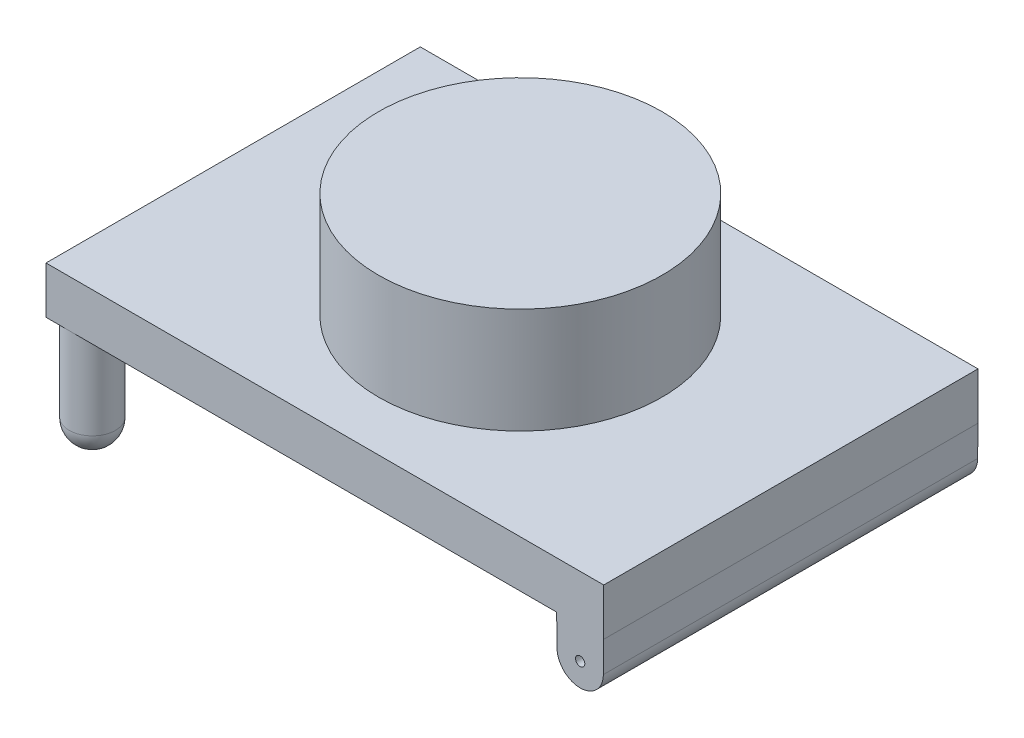
ISO-10303-21;
HEADER;
FILE_DESCRIPTION(('STEP AP214'),'2;1');
FILE_NAME('part.step','',(''),(''),'','','');
FILE_SCHEMA(('AUTOMOTIVE_DESIGN { 1 0 10303 214 1 1 1 1 }'));
ENDSEC;
DATA;
#1=APPLICATION_CONTEXT('core data for automotive mechanical design processes');
#2=APPLICATION_PROTOCOL_DEFINITION('international standard','automotive_design',2000,#1);
#3=PRODUCT_CONTEXT('',#1,'mechanical');
#4=PRODUCT('Part','Part','',(#3));
#5=PRODUCT_RELATED_PRODUCT_CATEGORY('part','',(#4));
#6=PRODUCT_DEFINITION_FORMATION('','',#4);
#7=PRODUCT_DEFINITION_CONTEXT('part definition',#1,'design');
#8=PRODUCT_DEFINITION('design','',#6,#7);
#9=PRODUCT_DEFINITION_SHAPE('','',#8);
#10=(LENGTH_UNIT() NAMED_UNIT(*) SI_UNIT(.MILLI.,.METRE.));
#11=(NAMED_UNIT(*) PLANE_ANGLE_UNIT() SI_UNIT($,.RADIAN.));
#12=(NAMED_UNIT(*) SI_UNIT($,.STERADIAN.) SOLID_ANGLE_UNIT());
#13=UNCERTAINTY_MEASURE_WITH_UNIT(LENGTH_MEASURE(1.E-05),#10,'distance_accuracy_value','');
#14=(GEOMETRIC_REPRESENTATION_CONTEXT(3) GLOBAL_UNCERTAINTY_ASSIGNED_CONTEXT((#13)) GLOBAL_UNIT_ASSIGNED_CONTEXT((#10,
#11,#12)) REPRESENTATION_CONTEXT('',''));
#15=CARTESIAN_POINT('',(0.,0.,0.));
#16=DIRECTION('',(0.,0.,1.));
#17=DIRECTION('',(1.,0.,0.));
#18=AXIS2_PLACEMENT_3D('',#15,#16,#17);
#19=CARTESIAN_POINT('',(0.,34.6,-101.));
#20=DIRECTION('',(0.,-1.,0.));
#21=DIRECTION('',(0.,0.,-1.));
#22=AXIS2_PLACEMENT_3D('',#19,#20,#21);
#23=PLANE('',#22);
#24=DIRECTION('',(1.,0.,0.));
#25=VECTOR('',#24,1.);
#26=CARTESIAN_POINT('',(0.,34.6,-101.));
#27=LINE('',#26,#25);
#28=CARTESIAN_POINT('',(-150.5,34.6,-101.));
#29=VERTEX_POINT('',#28);
#30=CARTESIAN_POINT('',(-138.,34.6,-101.));
#31=VERTEX_POINT('',#30);
#32=EDGE_CURVE('E119',#29,#31,#27,.T.);
#33=ORIENTED_EDGE('',*,*,#32,.T.);
#34=CARTESIAN_POINT('',(-138.,34.6,-88.5000000000004));
#35=DIRECTION('',(0.,-1.,0.));
#36=DIRECTION('',(0.,0.,-1.));
#37=AXIS2_PLACEMENT_3D('',#34,#35,#36);
#38=CIRCLE('',#37,12.5);
#39=CARTESIAN_POINT('',(-150.5,34.6,-88.5000000000004));
#40=VERTEX_POINT('',#39);
#41=EDGE_CURVE('E53',#31,#40,#38,.F.);
#42=ORIENTED_EDGE('',*,*,#41,.T.);
#43=DIRECTION('',(0.,0.,1.));
#44=VECTOR('',#43,1.);
#45=CARTESIAN_POINT('',(-150.5,34.6,-101.));
#46=LINE('',#45,#44);
#47=EDGE_CURVE('E117',#29,#40,#46,.T.);
#48=ORIENTED_EDGE('',*,*,#47,.F.);
#49=EDGE_LOOP('',(#33,#42,#48));
#50=FACE_BOUND('',#49,.T.);
#51=ADVANCED_FACE('F38',(#50),#23,.T.);
#52=CARTESIAN_POINT('',(-150.5,34.6,88.5));
#53=VERTEX_POINT('',#52);
#54=CARTESIAN_POINT('',(-150.5,34.6,101.));
#55=VERTEX_POINT('',#54);
#56=EDGE_CURVE('E127',#53,#55,#46,.T.);
#57=ORIENTED_EDGE('',*,*,#56,.F.);
#58=CARTESIAN_POINT('',(-138.,34.6,88.5));
#59=DIRECTION('',(0.,-1.,0.));
#60=DIRECTION('',(0.,0.,-1.));
#61=AXIS2_PLACEMENT_3D('',#58,#59,#60);
#62=CIRCLE('',#61,12.5);
#63=CARTESIAN_POINT('',(-138.,34.6,101.));
#64=VERTEX_POINT('',#63);
#65=EDGE_CURVE('E112',#64,#53,#62,.T.);
#66=ORIENTED_EDGE('',*,*,#65,.F.);
#67=DIRECTION('',(1.,0.,0.));
#68=VECTOR('',#67,1.);
#69=CARTESIAN_POINT('',(0.,34.6,101.));
#70=LINE('',#69,#68);
#71=EDGE_CURVE('E252',#55,#64,#70,.T.);
#72=ORIENTED_EDGE('',*,*,#71,.F.);
#73=EDGE_LOOP('',(#57,#66,#72));
#74=FACE_BOUND('',#73,.T.);
#75=ADVANCED_FACE('F188',(#74),#23,.T.);
#76=CARTESIAN_POINT('',(-150.5,60.,101.));
#77=DIRECTION('',(1.,0.,0.));
#78=DIRECTION('',(0.,0.,-1.));
#79=AXIS2_PLACEMENT_3D('',#76,#77,#78);
#80=PLANE('',#79);
#81=ORIENTED_EDGE('',*,*,#47,.T.);
#82=EDGE_CURVE('E61',#40,#53,#46,.T.);
#83=ORIENTED_EDGE('',*,*,#82,.T.);
#84=ORIENTED_EDGE('',*,*,#56,.T.);
#85=DIRECTION('',(0.,-1.,0.));
#86=VECTOR('',#85,1.);
#87=CARTESIAN_POINT('',(-150.5,60.,101.));
#88=LINE('',#87,#86);
#89=CARTESIAN_POINT('',(-150.5,60.,101.));
#90=VERTEX_POINT('',#89);
#91=EDGE_CURVE('E164',#90,#55,#88,.T.);
#92=ORIENTED_EDGE('',*,*,#91,.F.);
#93=DIRECTION('',(0.,0.,1.));
#94=VECTOR('',#93,1.);
#95=CARTESIAN_POINT('',(-150.5,60.,101.));
#96=LINE('',#95,#94);
#97=CARTESIAN_POINT('',(-150.5,60.,-101.));
#98=VERTEX_POINT('',#97);
#99=EDGE_CURVE('E148',#98,#90,#96,.T.);
#100=ORIENTED_EDGE('',*,*,#99,.F.);
#101=DIRECTION('',(0.,-1.,0.));
#102=VECTOR('',#101,1.);
#103=CARTESIAN_POINT('',(-150.5,60.,-101.));
#104=LINE('',#103,#102);
#105=EDGE_CURVE('E133',#98,#29,#104,.T.);
#106=ORIENTED_EDGE('',*,*,#105,.T.);
#107=EDGE_LOOP('',(#81,#83,#84,#92,#100,#106));
#108=FACE_BOUND('',#107,.T.);
#109=ADVANCED_FACE('F130',(#108),#80,.F.);
#110=CARTESIAN_POINT('',(150.5,60.,101.));
#111=DIRECTION('',(0.,0.,-1.));
#112=DIRECTION('',(-1.,0.,0.));
#113=AXIS2_PLACEMENT_3D('',#110,#111,#112);
#114=PLANE('',#113);
#115=CARTESIAN_POINT('',(137.8,18.,101.));
#116=DIRECTION('',(0.,0.,1.));
#117=DIRECTION('',(1.,0.,0.));
#118=AXIS2_PLACEMENT_3D('',#115,#116,#117);
#119=CIRCLE('',#118,2.5);
#120=CARTESIAN_POINT('',(140.3,18.,101.));
#121=VERTEX_POINT('',#120);
#122=EDGE_CURVE('E229',#121,#121,#119,.T.);
#123=ORIENTED_EDGE('',*,*,#122,.F.);
#124=EDGE_LOOP('',(#123));
#125=FACE_BOUND('',#124,.T.);
#126=DIRECTION('',(0.012047318414772,0.99992742842619,0.));
#127=VECTOR('',#126,1.);
#128=CARTESIAN_POINT('',(150.061349782293,-1.80796806966598,101.));
#129=LINE('',#128,#127);
#130=CARTESIAN_POINT('',(150.3,18.,101.));
#131=VERTEX_POINT('',#130);
#132=CARTESIAN_POINT('',(150.5,34.6,101.));
#133=VERTEX_POINT('',#132);
#134=EDGE_CURVE('E241',#131,#133,#129,.T.);
#135=ORIENTED_EDGE('',*,*,#134,.T.);
#136=DIRECTION('',(0.,-1.,0.));
#137=VECTOR('',#136,1.);
#138=CARTESIAN_POINT('',(150.5,60.,101.));
#139=LINE('',#138,#137);
#140=CARTESIAN_POINT('',(150.5,60.,101.));
#141=VERTEX_POINT('',#140);
#142=EDGE_CURVE('E161',#141,#133,#139,.T.);
#143=ORIENTED_EDGE('',*,*,#142,.F.);
#144=DIRECTION('',(1.,0.,0.));
#145=VECTOR('',#144,1.);
#146=CARTESIAN_POINT('',(150.5,60.,101.));
#147=LINE('',#146,#145);
#148=EDGE_CURVE('E151',#90,#141,#147,.T.);
#149=ORIENTED_EDGE('',*,*,#148,.F.);
#150=ORIENTED_EDGE('',*,*,#91,.T.);
#151=ORIENTED_EDGE('',*,*,#71,.T.);
#152=CARTESIAN_POINT('',(125.1,34.6,101.));
#153=VERTEX_POINT('',#152);
#154=EDGE_CURVE('E251',#64,#153,#70,.T.);
#155=ORIENTED_EDGE('',*,*,#154,.T.);
#156=DIRECTION('',(-0.012047318414772,0.99992742842619,0.));
#157=VECTOR('',#156,1.);
#158=CARTESIAN_POINT('',(125.498650217706,1.51203193033365,101.));
#159=LINE('',#158,#157);
#160=CARTESIAN_POINT('',(125.3,18.,101.));
#161=VERTEX_POINT('',#160);
#162=EDGE_CURVE('E249',#161,#153,#159,.T.);
#163=ORIENTED_EDGE('',*,*,#162,.F.);
#164=CARTESIAN_POINT('',(137.8,18.,101.));
#165=DIRECTION('',(0.,0.,1.));
#166=DIRECTION('',(1.,0.,0.));
#167=AXIS2_PLACEMENT_3D('',#164,#165,#166);
#168=CIRCLE('',#167,12.5);
#169=EDGE_CURVE('E237',#161,#131,#168,.T.);
#170=ORIENTED_EDGE('',*,*,#169,.T.);
#171=EDGE_LOOP('',(#135,#143,#149,#150,#151,#155,#163,#170));
#172=FACE_BOUND('',#171,.T.);
#173=ADVANCED_FACE('F264',(#125,#172),#114,.F.);
#174=CARTESIAN_POINT('',(150.5,60.,101.));
#175=DIRECTION('',(-1.,0.,0.));
#176=DIRECTION('',(0.,0.,1.));
#177=AXIS2_PLACEMENT_3D('',#174,#175,#176);
#178=PLANE('',#177);
#179=DIRECTION('',(0.,0.,1.));
#180=VECTOR('',#179,1.);
#181=CARTESIAN_POINT('',(150.5,34.6,-101.));
#182=LINE('',#181,#180);
#183=CARTESIAN_POINT('',(150.5,34.6,-101.));
#184=VERTEX_POINT('',#183);
#185=EDGE_CURVE('E134',#184,#133,#182,.T.);
#186=ORIENTED_EDGE('',*,*,#185,.F.);
#187=DIRECTION('',(0.,-1.,0.));
#188=VECTOR('',#187,1.);
#189=CARTESIAN_POINT('',(150.5,60.,-101.));
#190=LINE('',#189,#188);
#191=CARTESIAN_POINT('',(150.5,60.,-101.));
#192=VERTEX_POINT('',#191);
#193=EDGE_CURVE('E158',#192,#184,#190,.T.);
#194=ORIENTED_EDGE('',*,*,#193,.F.);
#195=DIRECTION('',(0.,0.,-1.));
#196=VECTOR('',#195,1.);
#197=CARTESIAN_POINT('',(150.5,60.,101.));
#198=LINE('',#197,#196);
#199=EDGE_CURVE('E153',#141,#192,#198,.T.);
#200=ORIENTED_EDGE('',*,*,#199,.F.);
#201=ORIENTED_EDGE('',*,*,#142,.T.);
#202=EDGE_LOOP('',(#186,#194,#200,#201));
#203=FACE_BOUND('',#202,.T.);
#204=ADVANCED_FACE('F273',(#203),#178,.F.);
#205=CARTESIAN_POINT('',(150.5,60.,-101.));
#206=DIRECTION('',(0.,0.,1.));
#207=DIRECTION('',(1.,0.,0.));
#208=AXIS2_PLACEMENT_3D('',#205,#206,#207);
#209=PLANE('',#208);
#210=CARTESIAN_POINT('',(137.8,18.,-101.));
#211=DIRECTION('',(0.,0.,1.));
#212=DIRECTION('',(1.,0.,0.));
#213=AXIS2_PLACEMENT_3D('',#210,#211,#212);
#214=CIRCLE('',#213,2.5);
#215=CARTESIAN_POINT('',(140.3,18.,-101.));
#216=VERTEX_POINT('',#215);
#217=EDGE_CURVE('E113',#216,#216,#214,.T.);
#218=ORIENTED_EDGE('',*,*,#217,.T.);
#219=EDGE_LOOP('',(#218));
#220=FACE_BOUND('',#219,.T.);
#221=DIRECTION('',(0.012047318414772,0.99992742842619,0.));
#222=VECTOR('',#221,1.);
#223=CARTESIAN_POINT('',(150.061349782293,-1.80796806966598,-101.));
#224=LINE('',#223,#222);
#225=CARTESIAN_POINT('',(150.3,18.,-101.));
#226=VERTEX_POINT('',#225);
#227=EDGE_CURVE('E145',#226,#184,#224,.T.);
#228=ORIENTED_EDGE('',*,*,#227,.F.);
#229=CARTESIAN_POINT('',(137.8,18.,-101.));
#230=DIRECTION('',(0.,0.,1.));
#231=DIRECTION('',(1.,0.,0.));
#232=AXIS2_PLACEMENT_3D('',#229,#230,#231);
#233=CIRCLE('',#232,12.5);
#234=CARTESIAN_POINT('',(125.3,18.,-101.));
#235=VERTEX_POINT('',#234);
#236=EDGE_CURVE('E238',#235,#226,#233,.T.);
#237=ORIENTED_EDGE('',*,*,#236,.F.);
#238=DIRECTION('',(-0.012047318414772,0.99992742842619,0.));
#239=VECTOR('',#238,1.);
#240=CARTESIAN_POINT('',(125.498650217706,1.51203193033365,-101.));
#241=LINE('',#240,#239);
#242=CARTESIAN_POINT('',(125.1,34.6,-101.));
#243=VERTEX_POINT('',#242);
#244=EDGE_CURVE('E240',#235,#243,#241,.T.);
#245=ORIENTED_EDGE('',*,*,#244,.T.);
#246=EDGE_CURVE('E244',#31,#243,#27,.T.);
#247=ORIENTED_EDGE('',*,*,#246,.F.);
#248=ORIENTED_EDGE('',*,*,#32,.F.);
#249=ORIENTED_EDGE('',*,*,#105,.F.);
#250=DIRECTION('',(-1.,0.,0.));
#251=VECTOR('',#250,1.);
#252=CARTESIAN_POINT('',(150.5,60.,-101.));
#253=LINE('',#252,#251);
#254=EDGE_CURVE('E155',#192,#98,#253,.T.);
#255=ORIENTED_EDGE('',*,*,#254,.F.);
#256=ORIENTED_EDGE('',*,*,#193,.T.);
#257=EDGE_LOOP('',(#228,#237,#245,#247,#248,#249,#255,#256));
#258=FACE_BOUND('',#257,.T.);
#259=ADVANCED_FACE('F268',(#220,#258),#209,.F.);
#260=CARTESIAN_POINT('',(0.,60.,0.));
#261=DIRECTION('',(0.,1.,0.));
#262=DIRECTION('',(0.,0.,1.));
#263=AXIS2_PLACEMENT_3D('',#260,#261,#262);
#264=PLANE('',#263);
#265=CARTESIAN_POINT('',(1.99999999999988,60.,-2.50000000000022));
#266=DIRECTION('',(0.,1.,0.));
#267=DIRECTION('',(0.,0.,1.));
#268=AXIS2_PLACEMENT_3D('',#265,#266,#267);
#269=CIRCLE('',#268,76.5000000000002);
#270=CARTESIAN_POINT('',(1.99999999999988,60.,-79.0000000000004));
#271=VERTEX_POINT('',#270);
#272=EDGE_CURVE('E11',#271,#271,#269,.T.);
#273=ORIENTED_EDGE('',*,*,#272,.F.);
#274=EDGE_LOOP('',(#273));
#275=FACE_BOUND('',#274,.T.);
#276=ORIENTED_EDGE('',*,*,#99,.T.);
#277=ORIENTED_EDGE('',*,*,#148,.T.);
#278=ORIENTED_EDGE('',*,*,#199,.T.);
#279=ORIENTED_EDGE('',*,*,#254,.T.);
#280=EDGE_LOOP('',(#276,#277,#278,#279));
#281=FACE_BOUND('',#280,.T.);
#282=ADVANCED_FACE('F210',(#275,#281),#264,.T.);
#283=CARTESIAN_POINT('',(137.8,18.,-101.));
#284=DIRECTION('',(0.,0.,1.));
#285=DIRECTION('',(1.,0.,0.));
#286=AXIS2_PLACEMENT_3D('',#283,#284,#285);
#287=CYLINDRICAL_SURFACE('',#286,12.5);
#288=ORIENTED_EDGE('',*,*,#169,.F.);
#289=DIRECTION('',(0.,0.,1.));
#290=VECTOR('',#289,1.);
#291=CARTESIAN_POINT('',(125.3,18.,-101.));
#292=LINE('',#291,#290);
#293=EDGE_CURVE('E142',#235,#161,#292,.T.);
#294=ORIENTED_EDGE('',*,*,#293,.F.);
#295=ORIENTED_EDGE('',*,*,#236,.T.);
#296=DIRECTION('',(0.,0.,1.));
#297=VECTOR('',#296,1.);
#298=CARTESIAN_POINT('',(150.3,18.,-101.));
#299=LINE('',#298,#297);
#300=EDGE_CURVE('E135',#226,#131,#299,.T.);
#301=ORIENTED_EDGE('',*,*,#300,.T.);
#302=EDGE_LOOP('',(#288,#294,#295,#301));
#303=FACE_BOUND('',#302,.T.);
#304=ADVANCED_FACE('F205',(#303),#287,.T.);
#305=CARTESIAN_POINT('',(150.061349782293,-1.80796806966598,-101.));
#306=DIRECTION('',(0.99992742842619,-0.012047318414772,0.));
#307=DIRECTION('',(0.012047318414772,0.99992742842619,0.));
#308=AXIS2_PLACEMENT_3D('',#305,#306,#307);
#309=PLANE('',#308);
#310=ORIENTED_EDGE('',*,*,#134,.F.);
#311=ORIENTED_EDGE('',*,*,#300,.F.);
#312=ORIENTED_EDGE('',*,*,#227,.T.);
#313=ORIENTED_EDGE('',*,*,#185,.T.);
#314=EDGE_LOOP('',(#310,#311,#312,#313));
#315=FACE_BOUND('',#314,.T.);
#316=ADVANCED_FACE('F199',(#315),#309,.T.);
#317=ORIENTED_EDGE('',*,*,#82,.F.);
#318=CARTESIAN_POINT('',(-138.,34.6,-88.5000000000004));
#319=DIRECTION('',(0.,-1.,0.));
#320=DIRECTION('',(0.,0.,-1.));
#321=AXIS2_PLACEMENT_3D('',#318,#319,#320);
#322=CIRCLE('',#321,12.5);
#323=EDGE_CURVE('E108',#31,#40,#322,.T.);
#324=ORIENTED_EDGE('',*,*,#323,.F.);
#325=ORIENTED_EDGE('',*,*,#246,.T.);
#326=DIRECTION('',(0.,0.,1.));
#327=VECTOR('',#326,1.);
#328=CARTESIAN_POINT('',(125.1,34.6,-101.));
#329=LINE('',#328,#327);
#330=EDGE_CURVE('E138',#243,#153,#329,.T.);
#331=ORIENTED_EDGE('',*,*,#330,.T.);
#332=ORIENTED_EDGE('',*,*,#154,.F.);
#333=CARTESIAN_POINT('',(-138.,34.6,88.5));
#334=DIRECTION('',(0.,-1.,0.));
#335=DIRECTION('',(0.,0.,-1.));
#336=AXIS2_PLACEMENT_3D('',#333,#334,#335);
#337=CIRCLE('',#336,12.5);
#338=EDGE_CURVE('E121',#64,#53,#337,.F.);
#339=ORIENTED_EDGE('',*,*,#338,.T.);
#340=EDGE_LOOP('',(#317,#324,#325,#331,#332,#339));
#341=FACE_BOUND('',#340,.T.);
#342=ADVANCED_FACE('F124',(#341),#23,.T.);
#343=CARTESIAN_POINT('',(125.498650217706,1.51203193033365,-101.));
#344=DIRECTION('',(0.99992742842619,0.012047318414772,0.));
#345=DIRECTION('',(-0.012047318414772,0.99992742842619,0.));
#346=AXIS2_PLACEMENT_3D('',#343,#344,#345);
#347=PLANE('',#346);
#348=ORIENTED_EDGE('',*,*,#162,.T.);
#349=ORIENTED_EDGE('',*,*,#330,.F.);
#350=ORIENTED_EDGE('',*,*,#244,.F.);
#351=ORIENTED_EDGE('',*,*,#293,.T.);
#352=EDGE_LOOP('',(#348,#349,#350,#351));
#353=FACE_BOUND('',#352,.T.);
#354=ADVANCED_FACE('F198',(#353),#347,.F.);
#355=CARTESIAN_POINT('',(-138.,-24.5,88.5));
#356=DIRECTION('',(0.,1.,0.));
#357=DIRECTION('',(0.,0.,1.));
#358=AXIS2_PLACEMENT_3D('',#355,#356,#357);
#359=CYLINDRICAL_SURFACE('',#358,12.5);
#360=CARTESIAN_POINT('',(-138.,-12.,88.5));
#361=DIRECTION('',(0.,1.,0.));
#362=DIRECTION('',(0.,0.,1.));
#363=AXIS2_PLACEMENT_3D('',#360,#361,#362);
#364=CIRCLE('',#363,12.5);
#365=CARTESIAN_POINT('',(-138.,-12.,101.));
#366=VERTEX_POINT('',#365);
#367=EDGE_CURVE('E42',#366,#366,#364,.T.);
#368=ORIENTED_EDGE('',*,*,#367,.T.);
#369=EDGE_LOOP('',(#368));
#370=FACE_BOUND('',#369,.T.);
#371=ORIENTED_EDGE('',*,*,#65,.T.);
#372=ORIENTED_EDGE('',*,*,#338,.F.);
#373=EDGE_LOOP('',(#371,#372));
#374=FACE_BOUND('',#373,.T.);
#375=ADVANCED_FACE('F173',(#370,#374),#359,.T.);
#376=CARTESIAN_POINT('',(-138.,-24.5,-88.5000000000004));
#377=DIRECTION('',(0.,1.,0.));
#378=DIRECTION('',(0.,0.,1.));
#379=AXIS2_PLACEMENT_3D('',#376,#377,#378);
#380=CYLINDRICAL_SURFACE('',#379,12.5);
#381=CARTESIAN_POINT('',(-138.,-12.,-88.5000000000004));
#382=DIRECTION('',(0.,1.,0.));
#383=DIRECTION('',(0.,0.,1.));
#384=AXIS2_PLACEMENT_3D('',#381,#382,#383);
#385=CIRCLE('',#384,12.5);
#386=CARTESIAN_POINT('',(-138.,-12.,-76.0000000000004));
#387=VERTEX_POINT('',#386);
#388=EDGE_CURVE('E120',#387,#387,#385,.T.);
#389=ORIENTED_EDGE('',*,*,#388,.T.);
#390=EDGE_LOOP('',(#389));
#391=FACE_BOUND('',#390,.T.);
#392=ORIENTED_EDGE('',*,*,#323,.T.);
#393=ORIENTED_EDGE('',*,*,#41,.F.);
#394=EDGE_LOOP('',(#392,#393));
#395=FACE_BOUND('',#394,.T.);
#396=ADVANCED_FACE('F109',(#391,#395),#380,.T.);
#397=CARTESIAN_POINT('',(-138.,-12.,-88.5000000000004));
#398=DIRECTION('',(0.,-1.,0.));
#399=DIRECTION('',(0.,0.,-1.));
#400=AXIS2_PLACEMENT_3D('',#397,#398,#399);
#401=SPHERICAL_SURFACE('',#400,12.5);
#402=ORIENTED_EDGE('',*,*,#388,.F.);
#403=EDGE_LOOP('',(#402));
#404=FACE_BOUND('',#403,.T.);
#405=ADVANCED_FACE('F178',(#404),#401,.T.);
#406=CARTESIAN_POINT('',(-138.,-12.,88.5));
#407=DIRECTION('',(0.,-1.,0.));
#408=DIRECTION('',(0.,0.,-1.));
#409=AXIS2_PLACEMENT_3D('',#406,#407,#408);
#410=SPHERICAL_SURFACE('',#409,12.5);
#411=ORIENTED_EDGE('',*,*,#367,.F.);
#412=EDGE_LOOP('',(#411));
#413=FACE_BOUND('',#412,.T.);
#414=ADVANCED_FACE('F40',(#413),#410,.T.);
#415=CARTESIAN_POINT('',(137.8,18.,-101.));
#416=DIRECTION('',(0.,0.,1.));
#417=DIRECTION('',(1.,0.,0.));
#418=AXIS2_PLACEMENT_3D('',#415,#416,#417);
#419=CYLINDRICAL_SURFACE('',#418,2.5);
#420=ORIENTED_EDGE('',*,*,#217,.F.);
#421=EDGE_LOOP('',(#420));
#422=FACE_BOUND('',#421,.T.);
#423=ORIENTED_EDGE('',*,*,#122,.T.);
#424=EDGE_LOOP('',(#423));
#425=FACE_BOUND('',#424,.T.);
#426=ADVANCED_FACE('F177',(#422,#425),#419,.F.);
#427=CARTESIAN_POINT('',(1.99999999999988,117.,-2.50000000000022));
#428=DIRECTION('',(0.,-1.,0.));
#429=DIRECTION('',(0.,0.,-1.));
#430=AXIS2_PLACEMENT_3D('',#427,#428,#429);
#431=CYLINDRICAL_SURFACE('',#430,76.5000000000002);
#432=CARTESIAN_POINT('',(1.99999999999988,117.,-2.50000000000022));
#433=DIRECTION('',(0.,1.,0.));
#434=DIRECTION('',(0.,0.,1.));
#435=AXIS2_PLACEMENT_3D('',#432,#433,#434);
#436=CIRCLE('',#435,76.5000000000002);
#437=CARTESIAN_POINT('',(1.99999999999988,117.,-79.0000000000004));
#438=VERTEX_POINT('',#437);
#439=EDGE_CURVE('E228',#438,#438,#436,.T.);
#440=CARTESIAN_POINT('',(1.99999999999988,117.,-79.0000000000004));
#441=CARTESIAN_POINT('',(1.99999999999988,116.40625,-79.0000000000004));
#442=CARTESIAN_POINT('',(1.99999999999988,115.8125,-79.0000000000004));
#443=CARTESIAN_POINT('',(1.99999999999988,114.625,-79.0000000000004));
#444=CARTESIAN_POINT('',(1.99999999999988,114.03125,-79.0000000000004));
#445=CARTESIAN_POINT('',(1.99999999999988,112.84375,-79.0000000000004));
#446=CARTESIAN_POINT('',(1.99999999999988,112.25,-79.0000000000004));
#447=CARTESIAN_POINT('',(1.99999999999988,111.0625,-79.0000000000004));
#448=CARTESIAN_POINT('',(1.99999999999988,110.46875,-79.0000000000004));
#449=CARTESIAN_POINT('',(1.99999999999988,109.28125,-79.0000000000004));
#450=CARTESIAN_POINT('',(1.99999999999988,108.6875,-79.0000000000004));
#451=CARTESIAN_POINT('',(1.99999999999988,107.5,-79.0000000000004));
#452=CARTESIAN_POINT('',(1.99999999999988,106.90625,-79.0000000000004));
#453=CARTESIAN_POINT('',(1.99999999999988,105.71875,-79.0000000000004));
#454=CARTESIAN_POINT('',(1.99999999999988,105.125,-79.0000000000004));
#455=CARTESIAN_POINT('',(1.99999999999988,103.9375,-79.0000000000004));
#456=CARTESIAN_POINT('',(1.99999999999988,103.34375,-79.0000000000004));
#457=CARTESIAN_POINT('',(1.99999999999988,102.15625,-79.0000000000004));
#458=CARTESIAN_POINT('',(1.99999999999988,101.5625,-79.0000000000004));
#459=CARTESIAN_POINT('',(1.99999999999988,100.375,-79.0000000000004));
#460=CARTESIAN_POINT('',(1.99999999999988,99.78125,-79.0000000000004));
#461=CARTESIAN_POINT('',(1.99999999999988,98.59375,-79.0000000000004));
#462=CARTESIAN_POINT('',(1.99999999999988,98.,-79.0000000000004));
#463=CARTESIAN_POINT('',(1.99999999999988,96.8125,-79.0000000000004));
#464=CARTESIAN_POINT('',(1.99999999999988,96.21875,-79.0000000000004));
#465=CARTESIAN_POINT('',(1.99999999999988,95.03125,-79.0000000000004));
#466=CARTESIAN_POINT('',(1.99999999999988,94.4375,-79.0000000000004));
#467=CARTESIAN_POINT('',(1.99999999999988,93.25,-79.0000000000004));
#468=CARTESIAN_POINT('',(1.99999999999988,92.65625,-79.0000000000004));
#469=CARTESIAN_POINT('',(1.99999999999988,91.46875,-79.0000000000004));
#470=CARTESIAN_POINT('',(1.99999999999988,90.875,-79.0000000000004));
#471=CARTESIAN_POINT('',(1.99999999999988,89.6875,-79.0000000000004));
#472=CARTESIAN_POINT('',(1.99999999999988,89.09375,-79.0000000000004));
#473=CARTESIAN_POINT('',(1.99999999999988,87.90625,-79.0000000000004));
#474=CARTESIAN_POINT('',(1.99999999999988,87.3125,-79.0000000000004));
#475=CARTESIAN_POINT('',(1.99999999999988,86.125,-79.0000000000004));
#476=CARTESIAN_POINT('',(1.99999999999988,85.53125,-79.0000000000004));
#477=CARTESIAN_POINT('',(1.99999999999988,84.34375,-79.0000000000004));
#478=CARTESIAN_POINT('',(1.99999999999988,83.75,-79.0000000000004));
#479=CARTESIAN_POINT('',(1.99999999999988,82.5625,-79.0000000000004));
#480=CARTESIAN_POINT('',(1.99999999999988,81.96875,-79.0000000000004));
#481=CARTESIAN_POINT('',(1.99999999999988,80.78125,-79.0000000000004));
#482=CARTESIAN_POINT('',(1.99999999999988,80.1875,-79.0000000000004));
#483=CARTESIAN_POINT('',(1.99999999999988,79.,-79.0000000000004));
#484=CARTESIAN_POINT('',(1.99999999999988,78.40625,-79.0000000000004));
#485=CARTESIAN_POINT('',(1.99999999999988,77.21875,-79.0000000000004));
#486=CARTESIAN_POINT('',(1.99999999999988,76.625,-79.0000000000004));
#487=CARTESIAN_POINT('',(1.99999999999988,75.4375,-79.0000000000004));
#488=CARTESIAN_POINT('',(1.99999999999988,74.84375,-79.0000000000004));
#489=CARTESIAN_POINT('',(1.99999999999988,73.65625,-79.0000000000004));
#490=CARTESIAN_POINT('',(1.99999999999988,73.0625,-79.0000000000004));
#491=CARTESIAN_POINT('',(1.99999999999988,71.875,-79.0000000000004));
#492=CARTESIAN_POINT('',(1.99999999999988,71.28125,-79.0000000000004));
#493=CARTESIAN_POINT('',(1.99999999999988,70.09375,-79.0000000000004));
#494=CARTESIAN_POINT('',(1.99999999999988,69.5,-79.0000000000004));
#495=CARTESIAN_POINT('',(1.99999999999988,68.3125,-79.0000000000004));
#496=CARTESIAN_POINT('',(1.99999999999988,67.71875,-79.0000000000004));
#497=CARTESIAN_POINT('',(1.99999999999988,66.53125,-79.0000000000004));
#498=CARTESIAN_POINT('',(1.99999999999988,65.9375,-79.0000000000004));
#499=CARTESIAN_POINT('',(1.99999999999988,64.75,-79.0000000000004));
#500=CARTESIAN_POINT('',(1.99999999999988,64.15625,-79.0000000000004));
#501=CARTESIAN_POINT('',(1.99999999999988,62.96875,-79.0000000000004));
#502=CARTESIAN_POINT('',(1.99999999999988,62.375,-79.0000000000004));
#503=CARTESIAN_POINT('',(1.99999999999988,61.1875,-79.0000000000004));
#504=CARTESIAN_POINT('',(1.99999999999988,60.59375,-79.0000000000004));
#505=CARTESIAN_POINT('',(1.99999999999988,60.,-79.0000000000004));
#506=B_SPLINE_CURVE_WITH_KNOTS('',3,(#440,#441,#442,#443,#444,#445,#446,#447,#448,#449,#450,
#451,#452,#453,#454,#455,#456,#457,#458,#459,#460,#461,#462,#463,#464,#465,#466,#467,#468,#469,
#470,#471,#472,#473,#474,#475,#476,#477,#478,#479,#480,#481,#482,#483,#484,#485,#486,#487,#488,
#489,#490,#491,#492,#493,#494,#495,#496,#497,#498,#499,#500,#501,#502,#503,#504,#505),
.UNSPECIFIED.,.F.,.F.,(4,2,2,2,2,2,2,2,2,2,2,2,2,2,2,2,2,2,2,2,2,2,2,2,2,2,2,2,2,2,2,2,4),(0.,
1.78125000000001,3.56250000000001,5.34375000000001,7.12500000000001,8.90625,10.6875,12.46875,
14.25,16.03125,17.8125,19.59375,21.375,23.15625,24.9375,26.71875,28.5,30.28125,32.0625,33.84375,
35.625,37.40625,39.1875,40.96875,42.75,44.53125,46.3125,48.09375,49.875,51.65625,53.4375,
55.21875,57.),.UNSPECIFIED.);
#507=EDGE_CURVE('BSEAM183',#438,#271,#506,.T.);
#508=ORIENTED_EDGE('',*,*,#439,.F.);
#509=ORIENTED_EDGE('',*,*,#272,.T.);
#510=ORIENTED_EDGE('',*,*,#507,.T.);
#511=ORIENTED_EDGE('',*,*,#507,.F.);
#512=EDGE_LOOP('',(#508,#510,#509,#511));
#513=FACE_BOUND('',#512,.T.);
#514=ADVANCED_FACE('F183',(#513),#431,.T.);
#515=CARTESIAN_POINT('',(1.99999999999988,117.,-2.50000000000022));
#516=DIRECTION('',(0.,1.,0.));
#517=DIRECTION('',(0.,0.,1.));
#518=AXIS2_PLACEMENT_3D('',#515,#516,#517);
#519=PLANE('',#518);
#520=ORIENTED_EDGE('',*,*,#439,.T.);
#521=EDGE_LOOP('',(#520));
#522=FACE_BOUND('',#521,.T.);
#523=ADVANCED_FACE('F220',(#522),#519,.T.);
#524=CLOSED_SHELL('',(#51,#75,#109,#173,#204,#259,#282,#304,#316,#342,#354,#375,#396,#405,#414,
#426,#514,#523));
#525=MANIFOLD_SOLID_BREP('B2',#524);
#526=ADVANCED_BREP_SHAPE_REPRESENTATION('',(#18,#525),#14);
#527=SHAPE_DEFINITION_REPRESENTATION(#9,#526);
ENDSEC;
END-ISO-10303-21;
